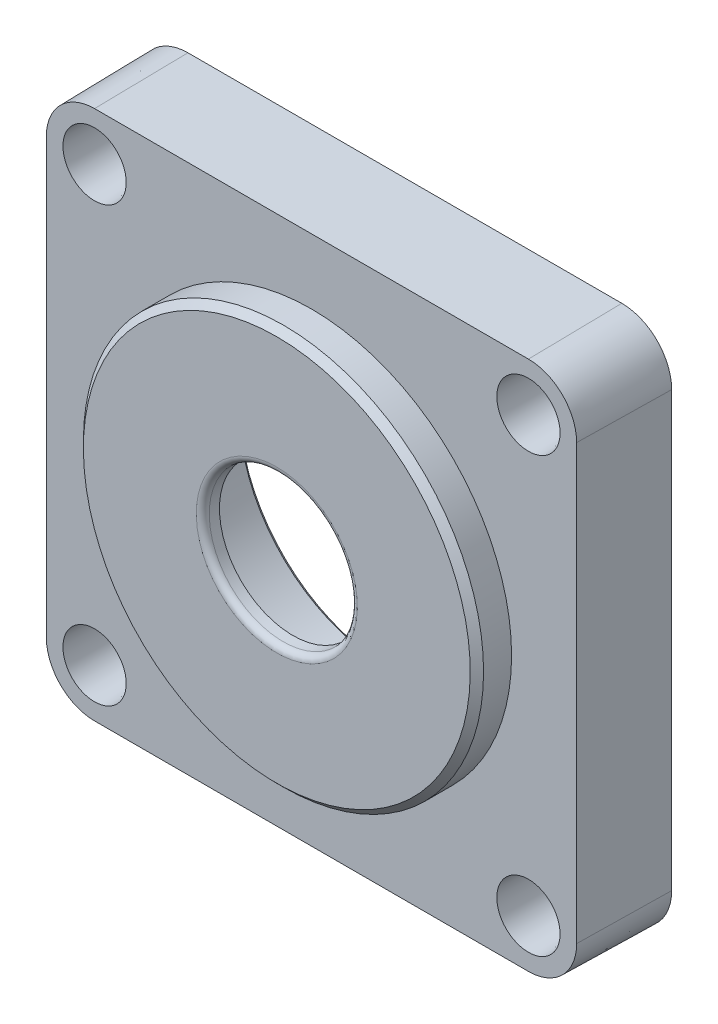
ISO-10303-21;
HEADER;
FILE_DESCRIPTION(('STEP AP214'),'2;1');
FILE_NAME('part.step','',(''),(''),'','','');
FILE_SCHEMA(('AUTOMOTIVE_DESIGN { 1 0 10303 214 1 1 1 1 }'));
ENDSEC;
DATA;
#1=APPLICATION_CONTEXT('core data for automotive mechanical design processes');
#2=APPLICATION_PROTOCOL_DEFINITION('international standard','automotive_design',2000,#1);
#3=PRODUCT_CONTEXT('',#1,'mechanical');
#4=PRODUCT('Part','Part','',(#3));
#5=PRODUCT_RELATED_PRODUCT_CATEGORY('part','',(#4));
#6=PRODUCT_DEFINITION_FORMATION('','',#4);
#7=PRODUCT_DEFINITION_CONTEXT('part definition',#1,'design');
#8=PRODUCT_DEFINITION('design','',#6,#7);
#9=PRODUCT_DEFINITION_SHAPE('','',#8);
#10=(LENGTH_UNIT() NAMED_UNIT(*) SI_UNIT(.MILLI.,.METRE.));
#11=(NAMED_UNIT(*) PLANE_ANGLE_UNIT() SI_UNIT($,.RADIAN.));
#12=(NAMED_UNIT(*) SI_UNIT($,.STERADIAN.) SOLID_ANGLE_UNIT());
#13=UNCERTAINTY_MEASURE_WITH_UNIT(LENGTH_MEASURE(1.E-05),#10,'distance_accuracy_value','');
#14=(GEOMETRIC_REPRESENTATION_CONTEXT(3) GLOBAL_UNCERTAINTY_ASSIGNED_CONTEXT((#13)) GLOBAL_UNIT_ASSIGNED_CONTEXT((#10,
#11,#12)) REPRESENTATION_CONTEXT('',''));
#15=CARTESIAN_POINT('',(0.,0.,0.));
#16=DIRECTION('',(0.,0.,1.));
#17=DIRECTION('',(1.,0.,0.));
#18=AXIS2_PLACEMENT_3D('',#15,#16,#17);
#19=CARTESIAN_POINT('',(0.,0.,-7.));
#20=DIRECTION('',(0.,0.,1.));
#21=DIRECTION('',(1.,0.,0.));
#22=AXIS2_PLACEMENT_3D('',#19,#20,#21);
#23=PLANE('',#22);
#24=CARTESIAN_POINT('',(-16.2634559672906,-16.2634559672906,-7.));
#25=DIRECTION('',(0.,0.,1.));
#26=DIRECTION('',(1.,0.,0.));
#27=AXIS2_PLACEMENT_3D('',#24,#25,#26);
#28=CIRCLE('',#27,2.25);
#29=CARTESIAN_POINT('',(-14.0134559672906,-16.2634559672906,-7.));
#30=VERTEX_POINT('',#29);
#31=EDGE_CURVE('E234',#30,#30,#28,.T.);
#32=ORIENTED_EDGE('',*,*,#31,.T.);
#33=EDGE_LOOP('',(#32));
#34=FACE_BOUND('',#33,.T.);
#35=CARTESIAN_POINT('',(16.2634559672906,-16.2634559672906,-7.));
#36=DIRECTION('',(0.,0.,1.));
#37=DIRECTION('',(1.,0.,0.));
#38=AXIS2_PLACEMENT_3D('',#35,#36,#37);
#39=CIRCLE('',#38,2.25);
#40=CARTESIAN_POINT('',(18.5134559672906,-16.2634559672906,-7.));
#41=VERTEX_POINT('',#40);
#42=EDGE_CURVE('E243',#41,#41,#39,.T.);
#43=ORIENTED_EDGE('',*,*,#42,.T.);
#44=EDGE_LOOP('',(#43));
#45=FACE_BOUND('',#44,.T.);
#46=CARTESIAN_POINT('',(16.2634559672906,16.2634559672906,-7.));
#47=DIRECTION('',(0.,0.,1.));
#48=DIRECTION('',(1.,0.,0.));
#49=AXIS2_PLACEMENT_3D('',#46,#47,#48);
#50=CIRCLE('',#49,2.25);
#51=CARTESIAN_POINT('',(18.5134559672906,16.2634559672906,-7.));
#52=VERTEX_POINT('',#51);
#53=EDGE_CURVE('E239',#52,#52,#50,.T.);
#54=ORIENTED_EDGE('',*,*,#53,.T.);
#55=EDGE_LOOP('',(#54));
#56=FACE_BOUND('',#55,.T.);
#57=CARTESIAN_POINT('',(-16.2634559672906,16.2634559672906,-7.));
#58=DIRECTION('',(0.,0.,1.));
#59=DIRECTION('',(1.,0.,0.));
#60=AXIS2_PLACEMENT_3D('',#57,#58,#59);
#61=CIRCLE('',#60,2.25);
#62=CARTESIAN_POINT('',(-14.0134559672906,16.2634559672906,-7.));
#63=VERTEX_POINT('',#62);
#64=EDGE_CURVE('E238',#63,#63,#61,.T.);
#65=ORIENTED_EDGE('',*,*,#64,.T.);
#66=EDGE_LOOP('',(#65));
#67=FACE_BOUND('',#66,.T.);
#68=CARTESIAN_POINT('',(0.,0.,-7.));
#69=DIRECTION('',(0.,0.,1.));
#70=DIRECTION('',(1.,0.,0.));
#71=AXIS2_PLACEMENT_3D('',#68,#69,#70);
#72=CIRCLE('',#71,18.55);
#73=CARTESIAN_POINT('',(18.55,0.,-7.));
#74=VERTEX_POINT('',#73);
#75=EDGE_CURVE('E143',#74,#74,#72,.T.);
#76=ORIENTED_EDGE('',*,*,#75,.T.);
#77=EDGE_LOOP('',(#76));
#78=FACE_BOUND('',#77,.T.);
#79=CARTESIAN_POINT('',(-16.2634559672906,-16.2634559672906,-7.));
#80=DIRECTION('',(0.,0.,1.));
#81=DIRECTION('',(1.,0.,0.));
#82=AXIS2_PLACEMENT_3D('',#79,#80,#81);
#83=CIRCLE('',#82,3.73654403270942);
#84=CARTESIAN_POINT('',(-20.,-16.2634559672906,-7.));
#85=VERTEX_POINT('',#84);
#86=CARTESIAN_POINT('',(-16.2634559672906,-20.,-7.));
#87=VERTEX_POINT('',#86);
#88=EDGE_CURVE('E130',#85,#87,#83,.T.);
#89=ORIENTED_EDGE('',*,*,#88,.F.);
#90=DIRECTION('',(0.,1.,0.));
#91=VECTOR('',#90,1.);
#92=CARTESIAN_POINT('',(-20.,0.,-7.));
#93=LINE('',#92,#91);
#94=CARTESIAN_POINT('',(-20.,16.2634559672906,-7.));
#95=VERTEX_POINT('',#94);
#96=EDGE_CURVE('E125',#95,#85,#93,.F.);
#97=ORIENTED_EDGE('',*,*,#96,.F.);
#98=CARTESIAN_POINT('',(-16.2634559672906,16.2634559672906,-7.));
#99=DIRECTION('',(0.,0.,1.));
#100=DIRECTION('',(1.,0.,0.));
#101=AXIS2_PLACEMENT_3D('',#98,#99,#100);
#102=CIRCLE('',#101,3.73654403270942);
#103=CARTESIAN_POINT('',(-16.2634559672906,20.,-7.));
#104=VERTEX_POINT('',#103);
#105=EDGE_CURVE('E128',#104,#95,#102,.T.);
#106=ORIENTED_EDGE('',*,*,#105,.F.);
#107=DIRECTION('',(1.,0.,0.));
#108=VECTOR('',#107,1.);
#109=CARTESIAN_POINT('',(0.,20.,-7.));
#110=LINE('',#109,#108);
#111=CARTESIAN_POINT('',(16.2634559672906,20.,-7.));
#112=VERTEX_POINT('',#111);
#113=EDGE_CURVE('E162',#112,#104,#110,.F.);
#114=ORIENTED_EDGE('',*,*,#113,.F.);
#115=CARTESIAN_POINT('',(16.2634559672906,16.2634559672906,-7.));
#116=DIRECTION('',(0.,0.,1.));
#117=DIRECTION('',(1.,0.,0.));
#118=AXIS2_PLACEMENT_3D('',#115,#116,#117);
#119=CIRCLE('',#118,3.73654403270942);
#120=CARTESIAN_POINT('',(20.,16.2634559672906,-7.));
#121=VERTEX_POINT('',#120);
#122=EDGE_CURVE('E114',#121,#112,#119,.T.);
#123=ORIENTED_EDGE('',*,*,#122,.F.);
#124=DIRECTION('',(0.,-1.,0.));
#125=VECTOR('',#124,1.);
#126=CARTESIAN_POINT('',(20.,0.,-7.));
#127=LINE('',#126,#125);
#128=CARTESIAN_POINT('',(20.,-16.2634559672906,-7.));
#129=VERTEX_POINT('',#128);
#130=EDGE_CURVE('E181',#129,#121,#127,.F.);
#131=ORIENTED_EDGE('',*,*,#130,.F.);
#132=CARTESIAN_POINT('',(16.2634559672906,-16.2634559672906,-7.));
#133=DIRECTION('',(0.,0.,1.));
#134=DIRECTION('',(1.,0.,0.));
#135=AXIS2_PLACEMENT_3D('',#132,#133,#134);
#136=CIRCLE('',#135,3.73654403270942);
#137=CARTESIAN_POINT('',(16.2634559672906,-20.,-7.));
#138=VERTEX_POINT('',#137);
#139=EDGE_CURVE('E178',#138,#129,#136,.T.);
#140=ORIENTED_EDGE('',*,*,#139,.F.);
#141=DIRECTION('',(-1.,0.,0.));
#142=VECTOR('',#141,1.);
#143=CARTESIAN_POINT('',(0.,-20.,-7.));
#144=LINE('',#143,#142);
#145=EDGE_CURVE('E173',#87,#138,#144,.F.);
#146=ORIENTED_EDGE('',*,*,#145,.F.);
#147=EDGE_LOOP('',(#89,#97,#106,#114,#123,#131,#140,#146));
#148=FACE_BOUND('',#147,.T.);
#149=ADVANCED_FACE('F55',(#34,#45,#56,#67,#78,#148),#23,.F.);
#150=CARTESIAN_POINT('',(-20.,0.,-7.));
#151=DIRECTION('',(-0.999847695156391,0.,0.0174524064372835));
#152=DIRECTION('',(0.0174524064372835,0.,0.999847695156391));
#153=AXIS2_PLACEMENT_3D('',#150,#151,#152);
#154=PLANE('',#153);
#155=DIRECTION('',(-0.0174524064372835,0.,-0.999847695156391));
#156=VECTOR('',#155,1.);
#157=CARTESIAN_POINT('',(-20.,16.2634559672906,-7.));
#158=LINE('',#157,#156);
#159=CARTESIAN_POINT('',(-19.8778145455025,16.2634559672906,0.));
#160=VERTEX_POINT('',#159);
#161=EDGE_CURVE('E134',#160,#95,#158,.T.);
#162=ORIENTED_EDGE('',*,*,#161,.T.);
#163=ORIENTED_EDGE('',*,*,#96,.T.);
#164=DIRECTION('',(-0.0174524064372836,0.,-0.999847695156391));
#165=VECTOR('',#164,1.);
#166=CARTESIAN_POINT('',(-20.,-16.2634559672906,-7.));
#167=LINE('',#166,#165);
#168=CARTESIAN_POINT('',(-19.8778145455025,-16.2634559672906,0.));
#169=VERTEX_POINT('',#168);
#170=EDGE_CURVE('E133',#169,#85,#167,.T.);
#171=ORIENTED_EDGE('',*,*,#170,.F.);
#172=DIRECTION('',(0.,1.,0.));
#173=VECTOR('',#172,1.);
#174=CARTESIAN_POINT('',(-19.8778145455025,0.,0.));
#175=LINE('',#174,#173);
#176=EDGE_CURVE('E139',#160,#169,#175,.F.);
#177=ORIENTED_EDGE('',*,*,#176,.F.);
#178=EDGE_LOOP('',(#162,#163,#171,#177));
#179=FACE_BOUND('',#178,.T.);
#180=ADVANCED_FACE('F137',(#179),#154,.T.);
#181=CARTESIAN_POINT('',(-16.2634559672906,-16.2634559672906,-7.));
#182=DIRECTION('',(0.,0.,-1.));
#183=DIRECTION('',(1.,0.,0.));
#184=AXIS2_PLACEMENT_3D('',#181,#182,#183);
#185=CONICAL_SURFACE('',#184,3.73654403270942,0.0174532925199433);
#186=ORIENTED_EDGE('',*,*,#170,.T.);
#187=ORIENTED_EDGE('',*,*,#88,.T.);
#188=DIRECTION('',(0.,-0.0174524064372835,-0.999847695156391));
#189=VECTOR('',#188,1.);
#190=CARTESIAN_POINT('',(-16.2634559672906,-20.,-7.));
#191=LINE('',#190,#189);
#192=CARTESIAN_POINT('',(-16.2634559672906,-19.8778145455025,0.));
#193=VERTEX_POINT('',#192);
#194=EDGE_CURVE('E165',#193,#87,#191,.T.);
#195=ORIENTED_EDGE('',*,*,#194,.F.);
#196=CARTESIAN_POINT('',(-16.2634559672906,-16.2634559672906,0.));
#197=DIRECTION('',(0.,0.,1.));
#198=DIRECTION('',(1.,0.,0.));
#199=AXIS2_PLACEMENT_3D('',#196,#197,#198);
#200=CIRCLE('',#199,3.61435857821189);
#201=EDGE_CURVE('E168',#169,#193,#200,.T.);
#202=ORIENTED_EDGE('',*,*,#201,.F.);
#203=EDGE_LOOP('',(#186,#187,#195,#202));
#204=FACE_BOUND('',#203,.T.);
#205=ADVANCED_FACE('F289',(#204),#185,.T.);
#206=CARTESIAN_POINT('',(0.,-20.,-7.));
#207=DIRECTION('',(0.,-0.999847695156391,0.0174524064372835));
#208=DIRECTION('',(0.,-0.0174524064372835,-0.999847695156391));
#209=AXIS2_PLACEMENT_3D('',#206,#207,#208);
#210=PLANE('',#209);
#211=ORIENTED_EDGE('',*,*,#194,.T.);
#212=ORIENTED_EDGE('',*,*,#145,.T.);
#213=DIRECTION('',(0.,-0.0174524064372835,-0.999847695156391));
#214=VECTOR('',#213,1.);
#215=CARTESIAN_POINT('',(16.2634559672906,-20.,-7.));
#216=LINE('',#215,#214);
#217=CARTESIAN_POINT('',(16.2634559672906,-19.8778145455025,0.));
#218=VERTEX_POINT('',#217);
#219=EDGE_CURVE('E169',#218,#138,#216,.T.);
#220=ORIENTED_EDGE('',*,*,#219,.F.);
#221=DIRECTION('',(-1.,0.,0.));
#222=VECTOR('',#221,1.);
#223=CARTESIAN_POINT('',(0.,-19.8778145455025,0.));
#224=LINE('',#223,#222);
#225=EDGE_CURVE('E172',#193,#218,#224,.F.);
#226=ORIENTED_EDGE('',*,*,#225,.F.);
#227=EDGE_LOOP('',(#211,#212,#220,#226));
#228=FACE_BOUND('',#227,.T.);
#229=ADVANCED_FACE('F292',(#228),#210,.T.);
#230=CARTESIAN_POINT('',(16.2634559672906,-16.2634559672906,-7.));
#231=DIRECTION('',(0.,0.,-1.));
#232=DIRECTION('',(1.,0.,0.));
#233=AXIS2_PLACEMENT_3D('',#230,#231,#232);
#234=CONICAL_SURFACE('',#233,3.73654403270942,0.0174532925199433);
#235=ORIENTED_EDGE('',*,*,#219,.T.);
#236=ORIENTED_EDGE('',*,*,#139,.T.);
#237=DIRECTION('',(0.0174524064372835,0.,-0.999847695156391));
#238=VECTOR('',#237,1.);
#239=CARTESIAN_POINT('',(20.,-16.2634559672906,-7.));
#240=LINE('',#239,#238);
#241=CARTESIAN_POINT('',(19.8778145455025,-16.2634559672906,0.));
#242=VERTEX_POINT('',#241);
#243=EDGE_CURVE('E174',#242,#129,#240,.T.);
#244=ORIENTED_EDGE('',*,*,#243,.F.);
#245=CARTESIAN_POINT('',(16.2634559672906,-16.2634559672906,0.));
#246=DIRECTION('',(0.,0.,1.));
#247=DIRECTION('',(1.,0.,0.));
#248=AXIS2_PLACEMENT_3D('',#245,#246,#247);
#249=CIRCLE('',#248,3.6143585782119);
#250=EDGE_CURVE('E177',#218,#242,#249,.T.);
#251=ORIENTED_EDGE('',*,*,#250,.F.);
#252=EDGE_LOOP('',(#235,#236,#244,#251));
#253=FACE_BOUND('',#252,.T.);
#254=ADVANCED_FACE('F296',(#253),#234,.T.);
#255=CARTESIAN_POINT('',(20.,0.,-7.));
#256=DIRECTION('',(0.999847695156391,0.,0.0174524064372835));
#257=DIRECTION('',(0.0174524064372835,0.,-0.999847695156391));
#258=AXIS2_PLACEMENT_3D('',#255,#256,#257);
#259=PLANE('',#258);
#260=ORIENTED_EDGE('',*,*,#243,.T.);
#261=ORIENTED_EDGE('',*,*,#130,.T.);
#262=DIRECTION('',(0.0174524064372835,0.,-0.999847695156391));
#263=VECTOR('',#262,1.);
#264=CARTESIAN_POINT('',(20.,16.2634559672906,-7.));
#265=LINE('',#264,#263);
#266=CARTESIAN_POINT('',(19.8778145455025,16.2634559672906,0.));
#267=VERTEX_POINT('',#266);
#268=EDGE_CURVE('E105',#267,#121,#265,.T.);
#269=ORIENTED_EDGE('',*,*,#268,.F.);
#270=DIRECTION('',(0.,-1.,0.));
#271=VECTOR('',#270,1.);
#272=CARTESIAN_POINT('',(19.8778145455025,0.,0.));
#273=LINE('',#272,#271);
#274=EDGE_CURVE('E180',#242,#267,#273,.F.);
#275=ORIENTED_EDGE('',*,*,#274,.F.);
#276=EDGE_LOOP('',(#260,#261,#269,#275));
#277=FACE_BOUND('',#276,.T.);
#278=ADVANCED_FACE('F300',(#277),#259,.T.);
#279=CARTESIAN_POINT('',(16.2634559672906,16.2634559672906,-7.));
#280=DIRECTION('',(0.,0.,-1.));
#281=DIRECTION('',(1.,0.,0.));
#282=AXIS2_PLACEMENT_3D('',#279,#280,#281);
#283=CONICAL_SURFACE('',#282,3.73654403270942,0.0174532925199433);
#284=ORIENTED_EDGE('',*,*,#268,.T.);
#285=ORIENTED_EDGE('',*,*,#122,.T.);
#286=DIRECTION('',(0.,0.0174524064372835,-0.999847695156391));
#287=VECTOR('',#286,1.);
#288=CARTESIAN_POINT('',(16.2634559672906,20.,-7.));
#289=LINE('',#288,#287);
#290=CARTESIAN_POINT('',(16.2634559672906,19.8778145455025,0.));
#291=VERTEX_POINT('',#290);
#292=EDGE_CURVE('E158',#291,#112,#289,.T.);
#293=ORIENTED_EDGE('',*,*,#292,.F.);
#294=CARTESIAN_POINT('',(16.2634559672906,16.2634559672906,0.));
#295=DIRECTION('',(0.,0.,1.));
#296=DIRECTION('',(1.,0.,0.));
#297=AXIS2_PLACEMENT_3D('',#294,#295,#296);
#298=CIRCLE('',#297,3.6143585782119);
#299=EDGE_CURVE('E161',#267,#291,#298,.T.);
#300=ORIENTED_EDGE('',*,*,#299,.F.);
#301=EDGE_LOOP('',(#284,#285,#293,#300));
#302=FACE_BOUND('',#301,.T.);
#303=ADVANCED_FACE('F284',(#302),#283,.T.);
#304=CARTESIAN_POINT('',(0.,20.,-7.));
#305=DIRECTION('',(0.,0.999847695156391,0.0174524064372835));
#306=DIRECTION('',(0.,-0.0174524064372835,0.999847695156391));
#307=AXIS2_PLACEMENT_3D('',#304,#305,#306);
#308=PLANE('',#307);
#309=ORIENTED_EDGE('',*,*,#292,.T.);
#310=ORIENTED_EDGE('',*,*,#113,.T.);
#311=DIRECTION('',(0.,0.0174524064372835,-0.999847695156391));
#312=VECTOR('',#311,1.);
#313=CARTESIAN_POINT('',(-16.2634559672906,20.,-7.));
#314=LINE('',#313,#312);
#315=CARTESIAN_POINT('',(-16.2634559672906,19.8778145455025,0.));
#316=VERTEX_POINT('',#315);
#317=EDGE_CURVE('E73',#316,#104,#314,.T.);
#318=ORIENTED_EDGE('',*,*,#317,.F.);
#319=DIRECTION('',(1.,0.,0.));
#320=VECTOR('',#319,1.);
#321=CARTESIAN_POINT('',(0.,19.8778145455025,0.));
#322=LINE('',#321,#320);
#323=EDGE_CURVE('E147',#291,#316,#322,.F.);
#324=ORIENTED_EDGE('',*,*,#323,.F.);
#325=EDGE_LOOP('',(#309,#310,#318,#324));
#326=FACE_BOUND('',#325,.T.);
#327=ADVANCED_FACE('F281',(#326),#308,.T.);
#328=CARTESIAN_POINT('',(-16.2634559672906,16.2634559672906,-7.));
#329=DIRECTION('',(0.,0.,-1.));
#330=DIRECTION('',(1.,0.,0.));
#331=AXIS2_PLACEMENT_3D('',#328,#329,#330);
#332=CONICAL_SURFACE('',#331,3.73654403270942,0.0174532925199433);
#333=ORIENTED_EDGE('',*,*,#317,.T.);
#334=ORIENTED_EDGE('',*,*,#105,.T.);
#335=ORIENTED_EDGE('',*,*,#161,.F.);
#336=CARTESIAN_POINT('',(-16.2634559672906,16.2634559672906,0.));
#337=DIRECTION('',(0.,0.,1.));
#338=DIRECTION('',(1.,0.,0.));
#339=AXIS2_PLACEMENT_3D('',#336,#337,#338);
#340=CIRCLE('',#339,3.6143585782119);
#341=EDGE_CURVE('E146',#316,#160,#340,.T.);
#342=ORIENTED_EDGE('',*,*,#341,.F.);
#343=EDGE_LOOP('',(#333,#334,#335,#342));
#344=FACE_BOUND('',#343,.T.);
#345=ADVANCED_FACE('F145',(#344),#332,.T.);
#346=CARTESIAN_POINT('',(-16.2634559672906,16.2634559672906,0.));
#347=DIRECTION('',(0.,0.,1.));
#348=DIRECTION('',(1.,0.,0.));
#349=AXIS2_PLACEMENT_3D('',#346,#347,#348);
#350=PLANE('',#349);
#351=CARTESIAN_POINT('',(-16.2634559672906,-16.2634559672906,0.));
#352=DIRECTION('',(0.,0.,1.));
#353=DIRECTION('',(1.,0.,0.));
#354=AXIS2_PLACEMENT_3D('',#351,#352,#353);
#355=CIRCLE('',#354,2.37218545449752);
#356=CARTESIAN_POINT('',(-13.8912705127931,-16.2634559672906,0.));
#357=VERTEX_POINT('',#356);
#358=EDGE_CURVE('E231',#357,#357,#355,.T.);
#359=ORIENTED_EDGE('',*,*,#358,.F.);
#360=EDGE_LOOP('',(#359));
#361=FACE_BOUND('',#360,.T.);
#362=CARTESIAN_POINT('',(16.2634559672906,-16.2634559672906,0.));
#363=DIRECTION('',(0.,0.,1.));
#364=DIRECTION('',(1.,0.,0.));
#365=AXIS2_PLACEMENT_3D('',#362,#363,#364);
#366=CIRCLE('',#365,2.37218545449752);
#367=CARTESIAN_POINT('',(18.6356414217881,-16.2634559672906,0.));
#368=VERTEX_POINT('',#367);
#369=EDGE_CURVE('E244',#368,#368,#366,.T.);
#370=ORIENTED_EDGE('',*,*,#369,.F.);
#371=EDGE_LOOP('',(#370));
#372=FACE_BOUND('',#371,.T.);
#373=CARTESIAN_POINT('',(16.2634559672906,16.2634559672906,0.));
#374=DIRECTION('',(0.,0.,1.));
#375=DIRECTION('',(1.,0.,0.));
#376=AXIS2_PLACEMENT_3D('',#373,#374,#375);
#377=CIRCLE('',#376,2.37218545449752);
#378=CARTESIAN_POINT('',(18.6356414217881,16.2634559672906,0.));
#379=VERTEX_POINT('',#378);
#380=EDGE_CURVE('E240',#379,#379,#377,.T.);
#381=ORIENTED_EDGE('',*,*,#380,.F.);
#382=EDGE_LOOP('',(#381));
#383=FACE_BOUND('',#382,.T.);
#384=CARTESIAN_POINT('',(-16.2634559672906,16.2634559672906,0.));
#385=DIRECTION('',(0.,0.,1.));
#386=DIRECTION('',(1.,0.,0.));
#387=AXIS2_PLACEMENT_3D('',#384,#385,#386);
#388=CIRCLE('',#387,2.37218545449753);
#389=CARTESIAN_POINT('',(-13.8912705127931,16.2634559672906,0.));
#390=VERTEX_POINT('',#389);
#391=EDGE_CURVE('E235',#390,#390,#388,.T.);
#392=ORIENTED_EDGE('',*,*,#391,.F.);
#393=EDGE_LOOP('',(#392));
#394=FACE_BOUND('',#393,.T.);
#395=CARTESIAN_POINT('',(0.,0.,0.));
#396=DIRECTION('',(0.,0.,1.));
#397=DIRECTION('',(1.,0.,0.));
#398=AXIS2_PLACEMENT_3D('',#395,#396,#397);
#399=CIRCLE('',#398,15.);
#400=CARTESIAN_POINT('',(15.,0.,0.));
#401=VERTEX_POINT('',#400);
#402=EDGE_CURVE('E149',#401,#401,#399,.F.);
#403=ORIENTED_EDGE('',*,*,#402,.T.);
#404=EDGE_LOOP('',(#403));
#405=FACE_BOUND('',#404,.T.);
#406=ORIENTED_EDGE('',*,*,#341,.T.);
#407=ORIENTED_EDGE('',*,*,#176,.T.);
#408=ORIENTED_EDGE('',*,*,#201,.T.);
#409=ORIENTED_EDGE('',*,*,#225,.T.);
#410=ORIENTED_EDGE('',*,*,#250,.T.);
#411=ORIENTED_EDGE('',*,*,#274,.T.);
#412=ORIENTED_EDGE('',*,*,#299,.T.);
#413=ORIENTED_EDGE('',*,*,#323,.T.);
#414=EDGE_LOOP('',(#406,#407,#408,#409,#410,#411,#412,#413));
#415=FACE_BOUND('',#414,.T.);
#416=ADVANCED_FACE('F273',(#361,#372,#383,#394,#405,#415),#350,.T.);
#417=CARTESIAN_POINT('',(0.,0.,0.));
#418=DIRECTION('',(0.,0.,1.));
#419=DIRECTION('',(0.,-1.,0.));
#420=AXIS2_PLACEMENT_3D('',#417,#418,#419);
#421=CYLINDRICAL_SURFACE('',#420,15.);
#422=CARTESIAN_POINT('',(0.,0.,2.1));
#423=DIRECTION('',(0.,0.,-1.));
#424=DIRECTION('',(0.,1.,0.));
#425=AXIS2_PLACEMENT_3D('',#422,#423,#424);
#426=CIRCLE('',#425,15.);
#427=CARTESIAN_POINT('',(0.,15.,2.1));
#428=VERTEX_POINT('',#427);
#429=EDGE_CURVE('E12',#428,#428,#426,.T.);
#430=ORIENTED_EDGE('',*,*,#429,.T.);
#431=EDGE_LOOP('',(#430));
#432=FACE_BOUND('',#431,.T.);
#433=ORIENTED_EDGE('',*,*,#402,.F.);
#434=EDGE_LOOP('',(#433));
#435=FACE_BOUND('',#434,.T.);
#436=ADVANCED_FACE('F264',(#432,#435),#421,.T.);
#437=CARTESIAN_POINT('',(0.,15.,2.6));
#438=DIRECTION('',(0.,0.,-1.));
#439=DIRECTION('',(0.,1.,0.));
#440=AXIS2_PLACEMENT_3D('',#437,#438,#439);
#441=PLANE('',#440);
#442=CARTESIAN_POINT('',(0.,0.,2.6));
#443=DIRECTION('',(0.,0.,-1.));
#444=DIRECTION('',(0.,1.,0.));
#445=AXIS2_PLACEMENT_3D('',#442,#443,#444);
#446=CIRCLE('',#445,14.5);
#447=CARTESIAN_POINT('',(0.,14.5,2.6));
#448=VERTEX_POINT('',#447);
#449=EDGE_CURVE('E65',#448,#448,#446,.F.);
#450=ORIENTED_EDGE('',*,*,#449,.T.);
#451=EDGE_LOOP('',(#450));
#452=FACE_BOUND('',#451,.T.);
#453=CARTESIAN_POINT('',(0.,0.,2.6));
#454=DIRECTION('',(0.,0.,-1.));
#455=DIRECTION('',(0.,1.,0.));
#456=AXIS2_PLACEMENT_3D('',#453,#454,#455);
#457=CIRCLE('',#456,6.03737161849709);
#458=CARTESIAN_POINT('',(0.,6.03737161849709,2.6));
#459=VERTEX_POINT('',#458);
#460=EDGE_CURVE('E222',#459,#459,#457,.T.);
#461=ORIENTED_EDGE('',*,*,#460,.T.);
#462=EDGE_LOOP('',(#461));
#463=FACE_BOUND('',#462,.T.);
#464=ADVANCED_FACE('F249',(#452,#463),#441,.F.);
#465=CARTESIAN_POINT('',(0.,0.,24.4));
#466=DIRECTION('',(0.,0.,1.));
#467=DIRECTION('',(1.,0.,0.));
#468=AXIS2_PLACEMENT_3D('',#465,#466,#467);
#469=CYLINDRICAL_SURFACE('',#468,18.55);
#470=CARTESIAN_POINT('',(0.,0.,-5.55));
#471=DIRECTION('',(0.,0.,1.));
#472=DIRECTION('',(1.,0.,0.));
#473=AXIS2_PLACEMENT_3D('',#470,#471,#472);
#474=CIRCLE('',#473,18.55);
#475=CARTESIAN_POINT('',(18.55,0.,-5.55));
#476=VERTEX_POINT('',#475);
#477=EDGE_CURVE('E365',#476,#476,#474,.T.);
#478=ORIENTED_EDGE('',*,*,#477,.T.);
#479=EDGE_LOOP('',(#478));
#480=FACE_BOUND('',#479,.T.);
#481=ORIENTED_EDGE('',*,*,#75,.F.);
#482=EDGE_LOOP('',(#481));
#483=FACE_BOUND('',#482,.T.);
#484=ADVANCED_FACE('F263',(#480,#483),#469,.F.);
#485=CARTESIAN_POINT('',(0.,17.8679175033868,-5.55));
#486=DIRECTION('',(0.,0.,-1.));
#487=DIRECTION('',(-1.,0.,0.));
#488=AXIS2_PLACEMENT_3D('',#485,#486,#487);
#489=PLANE('',#488);
#490=CARTESIAN_POINT('',(0.,0.,-5.55));
#491=DIRECTION('',(0.,0.,-1.));
#492=DIRECTION('',(-1.,0.,0.));
#493=AXIS2_PLACEMENT_3D('',#490,#491,#492);
#494=CIRCLE('',#493,18.3423997867443);
#495=CARTESIAN_POINT('',(-18.3423997867443,0.,-5.55));
#496=VERTEX_POINT('',#495);
#497=EDGE_CURVE('E201',#496,#496,#494,.F.);
#498=ORIENTED_EDGE('',*,*,#497,.T.);
#499=EDGE_LOOP('',(#498));
#500=FACE_BOUND('',#499,.T.);
#501=ORIENTED_EDGE('',*,*,#477,.F.);
#502=EDGE_LOOP('',(#501));
#503=FACE_BOUND('',#502,.T.);
#504=ADVANCED_FACE('F270',(#500,#503),#489,.T.);
#505=CARTESIAN_POINT('',(0.,0.,-5.55));
#506=DIRECTION('',(0.,0.,-1.));
#507=DIRECTION('',(-1.,0.,0.));
#508=AXIS2_PLACEMENT_3D('',#505,#506,#507);
#509=CONICAL_SURFACE('',#508,17.8679175033868,0.0523598775598261);
#510=CARTESIAN_POINT('',(0.,0.,-3.77383202187853));
#511=DIRECTION('',(0.,0.,-1.));
#512=DIRECTION('',(-1.,0.,0.));
#513=AXIS2_PLACEMENT_3D('',#510,#511,#512);
#514=CIRCLE('',#513,17.7748324840198);
#515=CARTESIAN_POINT('',(-17.7748324840198,0.,-3.77383202187853));
#516=VERTEX_POINT('',#515);
#517=EDGE_CURVE('E207',#516,#516,#514,.F.);
#518=ORIENTED_EDGE('',*,*,#517,.T.);
#519=EDGE_LOOP('',(#518));
#520=FACE_BOUND('',#519,.T.);
#521=CARTESIAN_POINT('',(0.,0.,-5.07616797812149));
#522=DIRECTION('',(0.,0.,1.));
#523=DIRECTION('',(1.,0.,0.));
#524=AXIS2_PLACEMENT_3D('',#521,#522,#523);
#525=CIRCLE('',#524,17.843085019367);
#526=CARTESIAN_POINT('',(17.843085019367,0.,-5.07616797812149));
#527=VERTEX_POINT('',#526);
#528=EDGE_CURVE('E204',#527,#527,#525,.F.);
#529=ORIENTED_EDGE('',*,*,#528,.T.);
#530=EDGE_LOOP('',(#529));
#531=FACE_BOUND('',#530,.T.);
#532=ADVANCED_FACE('F425',(#520,#531),#509,.F.);
#533=CARTESIAN_POINT('',(0.,12.1362602261359,-3.3));
#534=DIRECTION('',(0.,0.,-1.));
#535=DIRECTION('',(-1.,0.,0.));
#536=AXIS2_PLACEMENT_3D('',#533,#534,#535);
#537=PLANE('',#536);
#538=CARTESIAN_POINT('',(0.,0.,-3.3));
#539=DIRECTION('',(0.,0.,-1.));
#540=DIRECTION('',(-1.,0.,0.));
#541=AXIS2_PLACEMENT_3D('',#538,#539,#540);
#542=CIRCLE('',#541,12.6107425094933);
#543=CARTESIAN_POINT('',(-12.6107425094933,0.,-3.3));
#544=VERTEX_POINT('',#543);
#545=EDGE_CURVE('E213',#544,#544,#542,.F.);
#546=ORIENTED_EDGE('',*,*,#545,.T.);
#547=EDGE_LOOP('',(#546));
#548=FACE_BOUND('',#547,.T.);
#549=CARTESIAN_POINT('',(0.,0.,-3.3));
#550=DIRECTION('',(0.,0.,-1.));
#551=DIRECTION('',(-1.,0.,0.));
#552=AXIS2_PLACEMENT_3D('',#549,#550,#551);
#553=CIRCLE('',#552,17.2755177166426);
#554=CARTESIAN_POINT('',(-17.2755177166426,0.,-3.3));
#555=VERTEX_POINT('',#554);
#556=EDGE_CURVE('E210',#555,#555,#553,.T.);
#557=ORIENTED_EDGE('',*,*,#556,.T.);
#558=EDGE_LOOP('',(#557));
#559=FACE_BOUND('',#558,.T.);
#560=ADVANCED_FACE('F421',(#548,#559),#537,.T.);
#561=CARTESIAN_POINT('',(0.,0.,-3.3));
#562=DIRECTION('',(0.,0.,1.));
#563=DIRECTION('',(1.,0.,0.));
#564=AXIS2_PLACEMENT_3D('',#561,#562,#563);
#565=CONICAL_SURFACE('',#564,12.1362602261359,0.0523598775598267);
#566=CARTESIAN_POINT('',(0.,0.,-3.77383202187853));
#567=DIRECTION('',(0.,0.,1.));
#568=DIRECTION('',(1.,0.,0.));
#569=AXIS2_PLACEMENT_3D('',#566,#567,#568);
#570=CIRCLE('',#569,12.1114277421161);
#571=CARTESIAN_POINT('',(12.1114277421161,0.,-3.77383202187853));
#572=VERTEX_POINT('',#571);
#573=EDGE_CURVE('E216',#572,#572,#570,.F.);
#574=ORIENTED_EDGE('',*,*,#573,.T.);
#575=EDGE_LOOP('',(#574));
#576=FACE_BOUND('',#575,.T.);
#577=CARTESIAN_POINT('',(0.,0.,-5.42616797812145));
#578=DIRECTION('',(0.,0.,-1.));
#579=DIRECTION('',(-1.,0.,0.));
#580=AXIS2_PLACEMENT_3D('',#577,#578,#579);
#581=CIRCLE('',#580,12.0248324840198);
#582=CARTESIAN_POINT('',(-12.0248324840198,0.,-5.42616797812145));
#583=VERTEX_POINT('',#582);
#584=EDGE_CURVE('E157',#583,#583,#581,.F.);
#585=ORIENTED_EDGE('',*,*,#584,.T.);
#586=EDGE_LOOP('',(#585));
#587=FACE_BOUND('',#586,.T.);
#588=ADVANCED_FACE('F417',(#576,#587),#565,.T.);
#589=CARTESIAN_POINT('',(0.,11.,-5.9));
#590=DIRECTION('',(0.,0.,-1.));
#591=DIRECTION('',(-1.,0.,0.));
#592=AXIS2_PLACEMENT_3D('',#589,#590,#591);
#593=PLANE('',#592);
#594=CARTESIAN_POINT('',(0.,0.,-5.9));
#595=DIRECTION('',(0.,0.,-1.));
#596=DIRECTION('',(-1.,0.,0.));
#597=AXIS2_PLACEMENT_3D('',#594,#595,#596);
#598=CIRCLE('',#597,11.3);
#599=CARTESIAN_POINT('',(-11.3,0.,-5.9));
#600=VERTEX_POINT('',#599);
#601=EDGE_CURVE('E225',#600,#600,#598,.F.);
#602=ORIENTED_EDGE('',*,*,#601,.T.);
#603=EDGE_LOOP('',(#602));
#604=FACE_BOUND('',#603,.T.);
#605=CARTESIAN_POINT('',(0.,0.,-5.9));
#606=DIRECTION('',(0.,0.,-1.));
#607=DIRECTION('',(-1.,0.,0.));
#608=AXIS2_PLACEMENT_3D('',#605,#606,#607);
#609=CIRCLE('',#608,11.5255177166426);
#610=CARTESIAN_POINT('',(-11.5255177166426,0.,-5.9));
#611=VERTEX_POINT('',#610);
#612=EDGE_CURVE('E198',#611,#611,#609,.T.);
#613=ORIENTED_EDGE('',*,*,#612,.T.);
#614=EDGE_LOOP('',(#613));
#615=FACE_BOUND('',#614,.T.);
#616=ADVANCED_FACE('F413',(#604,#615),#593,.T.);
#617=CARTESIAN_POINT('',(0.,0.,24.4));
#618=DIRECTION('',(0.,0.,1.));
#619=DIRECTION('',(1.,0.,0.));
#620=AXIS2_PLACEMENT_3D('',#617,#618,#619);
#621=CYLINDRICAL_SURFACE('',#620,11.);
#622=CARTESIAN_POINT('',(0.,0.,-5.59999999999999));
#623=DIRECTION('',(0.,0.,-1.));
#624=DIRECTION('',(-1.,0.,0.));
#625=AXIS2_PLACEMENT_3D('',#622,#623,#624);
#626=CIRCLE('',#625,11.);
#627=CARTESIAN_POINT('',(-11.,0.,-5.59999999999999));
#628=VERTEX_POINT('',#627);
#629=EDGE_CURVE('E228',#628,#628,#626,.T.);
#630=ORIENTED_EDGE('',*,*,#629,.T.);
#631=EDGE_LOOP('',(#630));
#632=FACE_BOUND('',#631,.T.);
#633=CARTESIAN_POINT('',(0.,0.,1.4));
#634=DIRECTION('',(0.,0.,1.));
#635=DIRECTION('',(1.,0.,0.));
#636=AXIS2_PLACEMENT_3D('',#633,#634,#635);
#637=CIRCLE('',#636,11.);
#638=CARTESIAN_POINT('',(11.,0.,1.4));
#639=VERTEX_POINT('',#638);
#640=EDGE_CURVE('E368',#639,#639,#637,.T.);
#641=ORIENTED_EDGE('',*,*,#640,.T.);
#642=EDGE_LOOP('',(#641));
#643=FACE_BOUND('',#642,.T.);
#644=ADVANCED_FACE('F408',(#632,#643),#621,.F.);
#645=CARTESIAN_POINT('',(0.,5.5,1.4));
#646=DIRECTION('',(0.,0.,-1.));
#647=DIRECTION('',(-1.,0.,0.));
#648=AXIS2_PLACEMENT_3D('',#645,#646,#647);
#649=PLANE('',#648);
#650=CARTESIAN_POINT('',(0.,0.,1.4));
#651=DIRECTION('',(0.,0.,1.));
#652=DIRECTION('',(1.,0.,0.));
#653=AXIS2_PLACEMENT_3D('',#650,#651,#652);
#654=CIRCLE('',#653,5.5);
#655=CARTESIAN_POINT('',(5.5,0.,1.4));
#656=VERTEX_POINT('',#655);
#657=EDGE_CURVE('E371',#656,#656,#654,.T.);
#658=ORIENTED_EDGE('',*,*,#657,.T.);
#659=EDGE_LOOP('',(#658));
#660=FACE_BOUND('',#659,.T.);
#661=ORIENTED_EDGE('',*,*,#640,.F.);
#662=EDGE_LOOP('',(#661));
#663=FACE_BOUND('',#662,.T.);
#664=ADVANCED_FACE('F399',(#660,#663),#649,.T.);
#665=CARTESIAN_POINT('',(0.,0.,1.4));
#666=DIRECTION('',(0.,0.,1.));
#667=DIRECTION('',(1.,0.,0.));
#668=AXIS2_PLACEMENT_3D('',#665,#666,#667);
#669=CONICAL_SURFACE('',#668,5.5,0.0523598775598334);
#670=CARTESIAN_POINT('',(0.,0.,2.12616797812147));
#671=DIRECTION('',(0.,0.,1.));
#672=DIRECTION('',(1.,0.,0.));
#673=AXIS2_PLACEMENT_3D('',#670,#671,#672);
#674=CIRCLE('',#673,5.5380568511198);
#675=CARTESIAN_POINT('',(5.5380568511198,0.,2.12616797812147));
#676=VERTEX_POINT('',#675);
#677=EDGE_CURVE('E219',#676,#676,#674,.T.);
#678=ORIENTED_EDGE('',*,*,#677,.T.);
#679=EDGE_LOOP('',(#678));
#680=FACE_BOUND('',#679,.T.);
#681=ORIENTED_EDGE('',*,*,#657,.F.);
#682=EDGE_LOOP('',(#681));
#683=FACE_BOUND('',#682,.T.);
#684=ADVANCED_FACE('F311',(#680,#683),#669,.F.);
#685=CARTESIAN_POINT('',(0.,0.,-5.4));
#686=DIRECTION('',(0.,0.,-1.));
#687=DIRECTION('',(-1.,0.,0.));
#688=AXIS2_PLACEMENT_3D('',#685,#686,#687);
#689=TOROIDAL_SURFACE('',#688,11.5255177166426,0.5);
#690=ORIENTED_EDGE('',*,*,#612,.F.);
#691=EDGE_LOOP('',(#690));
#692=FACE_BOUND('',#691,.T.);
#693=ORIENTED_EDGE('',*,*,#584,.F.);
#694=EDGE_LOOP('',(#693));
#695=FACE_BOUND('',#694,.T.);
#696=ADVANCED_FACE('F307',(#692,#695),#689,.T.);
#697=CARTESIAN_POINT('',(0.,0.,-5.05));
#698=DIRECTION('',(0.,0.,-1.));
#699=DIRECTION('',(-1.,0.,0.));
#700=AXIS2_PLACEMENT_3D('',#697,#698,#699);
#701=TOROIDAL_SURFACE('',#700,18.3423997867443,0.5);
#702=ORIENTED_EDGE('',*,*,#528,.F.);
#703=EDGE_LOOP('',(#702));
#704=FACE_BOUND('',#703,.T.);
#705=ORIENTED_EDGE('',*,*,#497,.F.);
#706=EDGE_LOOP('',(#705));
#707=FACE_BOUND('',#706,.T.);
#708=ADVANCED_FACE('F310',(#704,#707),#701,.T.);
#709=CARTESIAN_POINT('',(0.,0.,-3.8));
#710=DIRECTION('',(0.,0.,-1.));
#711=DIRECTION('',(-1.,0.,0.));
#712=AXIS2_PLACEMENT_3D('',#709,#710,#711);
#713=TOROIDAL_SURFACE('',#712,17.2755177166426,0.5);
#714=ORIENTED_EDGE('',*,*,#556,.F.);
#715=EDGE_LOOP('',(#714));
#716=FACE_BOUND('',#715,.T.);
#717=ORIENTED_EDGE('',*,*,#517,.F.);
#718=EDGE_LOOP('',(#717));
#719=FACE_BOUND('',#718,.T.);
#720=ADVANCED_FACE('F315',(#716,#719),#713,.F.);
#721=CARTESIAN_POINT('',(0.,0.,-3.8));
#722=DIRECTION('',(0.,0.,-1.));
#723=DIRECTION('',(-1.,0.,0.));
#724=AXIS2_PLACEMENT_3D('',#721,#722,#723);
#725=TOROIDAL_SURFACE('',#724,12.6107425094933,0.5);
#726=ORIENTED_EDGE('',*,*,#573,.F.);
#727=EDGE_LOOP('',(#726));
#728=FACE_BOUND('',#727,.T.);
#729=ORIENTED_EDGE('',*,*,#545,.F.);
#730=EDGE_LOOP('',(#729));
#731=FACE_BOUND('',#730,.T.);
#732=ADVANCED_FACE('F319',(#728,#731),#725,.F.);
#733=CARTESIAN_POINT('',(0.,0.,2.1));
#734=DIRECTION('',(0.,0.,-1.));
#735=DIRECTION('',(0.,1.,0.));
#736=AXIS2_PLACEMENT_3D('',#733,#734,#735);
#737=TOROIDAL_SURFACE('',#736,6.03737161849709,0.5);
#738=ORIENTED_EDGE('',*,*,#460,.F.);
#739=EDGE_LOOP('',(#738));
#740=FACE_BOUND('',#739,.T.);
#741=ORIENTED_EDGE('',*,*,#677,.F.);
#742=EDGE_LOOP('',(#741));
#743=FACE_BOUND('',#742,.T.);
#744=ADVANCED_FACE('F323',(#740,#743),#737,.T.);
#745=CARTESIAN_POINT('',(0.,0.,-5.9));
#746=DIRECTION('',(0.,0.,-1.));
#747=DIRECTION('',(-1.,0.,0.));
#748=AXIS2_PLACEMENT_3D('',#745,#746,#747);
#749=CONICAL_SURFACE('',#748,11.3,0.785398163397443);
#750=ORIENTED_EDGE('',*,*,#629,.F.);
#751=EDGE_LOOP('',(#750));
#752=FACE_BOUND('',#751,.T.);
#753=ORIENTED_EDGE('',*,*,#601,.F.);
#754=EDGE_LOOP('',(#753));
#755=FACE_BOUND('',#754,.T.);
#756=ADVANCED_FACE('F327',(#752,#755),#749,.F.);
#757=CARTESIAN_POINT('',(-16.2634559672906,16.2634559672906,-7.));
#758=DIRECTION('',(0.,0.,1.));
#759=DIRECTION('',(1.,0.,0.));
#760=AXIS2_PLACEMENT_3D('',#757,#758,#759);
#761=CONICAL_SURFACE('',#760,2.25,0.0174532925199433);
#762=ORIENTED_EDGE('',*,*,#64,.F.);
#763=EDGE_LOOP('',(#762));
#764=FACE_BOUND('',#763,.T.);
#765=ORIENTED_EDGE('',*,*,#391,.T.);
#766=EDGE_LOOP('',(#765));
#767=FACE_BOUND('',#766,.T.);
#768=ADVANCED_FACE('F333',(#764,#767),#761,.F.);
#769=CARTESIAN_POINT('',(16.2634559672906,16.2634559672906,-7.));
#770=DIRECTION('',(0.,0.,1.));
#771=DIRECTION('',(1.,0.,0.));
#772=AXIS2_PLACEMENT_3D('',#769,#770,#771);
#773=CONICAL_SURFACE('',#772,2.25,0.0174532925199433);
#774=ORIENTED_EDGE('',*,*,#53,.F.);
#775=EDGE_LOOP('',(#774));
#776=FACE_BOUND('',#775,.T.);
#777=ORIENTED_EDGE('',*,*,#380,.T.);
#778=EDGE_LOOP('',(#777));
#779=FACE_BOUND('',#778,.T.);
#780=ADVANCED_FACE('F338',(#776,#779),#773,.F.);
#781=CARTESIAN_POINT('',(16.2634559672906,-16.2634559672906,-7.));
#782=DIRECTION('',(0.,0.,1.));
#783=DIRECTION('',(1.,0.,0.));
#784=AXIS2_PLACEMENT_3D('',#781,#782,#783);
#785=CONICAL_SURFACE('',#784,2.25,0.0174532925199433);
#786=ORIENTED_EDGE('',*,*,#42,.F.);
#787=EDGE_LOOP('',(#786));
#788=FACE_BOUND('',#787,.T.);
#789=ORIENTED_EDGE('',*,*,#369,.T.);
#790=EDGE_LOOP('',(#789));
#791=FACE_BOUND('',#790,.T.);
#792=ADVANCED_FACE('F258',(#788,#791),#785,.F.);
#793=CARTESIAN_POINT('',(-16.2634559672906,-16.2634559672906,-7.));
#794=DIRECTION('',(0.,0.,1.));
#795=DIRECTION('',(1.,0.,0.));
#796=AXIS2_PLACEMENT_3D('',#793,#794,#795);
#797=CONICAL_SURFACE('',#796,2.25,0.0174532925199433);
#798=ORIENTED_EDGE('',*,*,#31,.F.);
#799=EDGE_LOOP('',(#798));
#800=FACE_BOUND('',#799,.T.);
#801=ORIENTED_EDGE('',*,*,#358,.T.);
#802=EDGE_LOOP('',(#801));
#803=FACE_BOUND('',#802,.T.);
#804=ADVANCED_FACE('F253',(#800,#803),#797,.F.);
#805=CARTESIAN_POINT('',(0.,0.,2.6));
#806=DIRECTION('',(0.,0.,-1.));
#807=DIRECTION('',(0.,1.,0.));
#808=AXIS2_PLACEMENT_3D('',#805,#806,#807);
#809=CONICAL_SURFACE('',#808,14.5,0.785398163397443);
#810=ORIENTED_EDGE('',*,*,#429,.F.);
#811=EDGE_LOOP('',(#810));
#812=FACE_BOUND('',#811,.T.);
#813=ORIENTED_EDGE('',*,*,#449,.F.);
#814=EDGE_LOOP('',(#813));
#815=FACE_BOUND('',#814,.T.);
#816=ADVANCED_FACE('F58',(#812,#815),#809,.T.);
#817=CLOSED_SHELL('',(#149,#180,#205,#229,#254,#278,#303,#327,#345,#416,#436,#464,#484,#504,
#532,#560,#588,#616,#644,#664,#684,#696,#708,#720,#732,#744,#756,#768,#780,#792,#804,#816));
#818=MANIFOLD_SOLID_BREP('B2',#817);
#819=ADVANCED_BREP_SHAPE_REPRESENTATION('',(#18,#818),#14);
#820=SHAPE_DEFINITION_REPRESENTATION(#9,#819);
ENDSEC;
END-ISO-10303-21;
